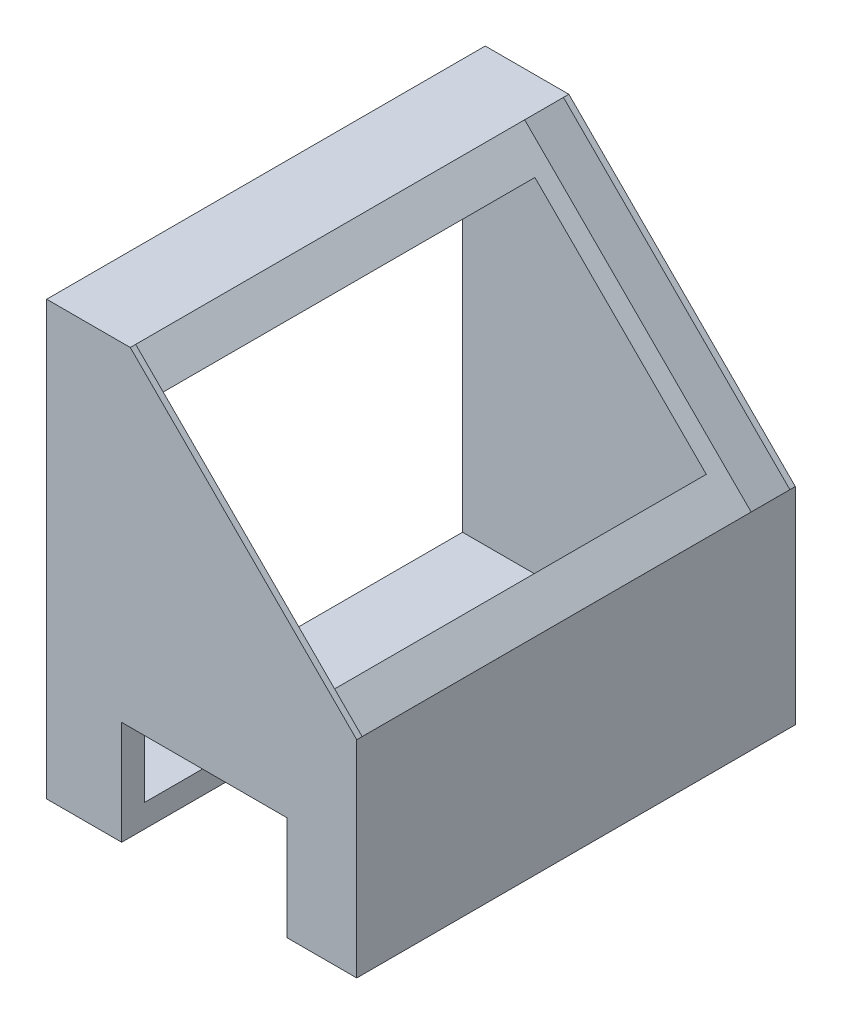
ISO-10303-21;
HEADER;
FILE_DESCRIPTION(('STEP AP214'),'2;1');
FILE_NAME('part.step','',(''),(''),'','','');
FILE_SCHEMA(('AUTOMOTIVE_DESIGN { 1 0 10303 214 1 1 1 1 }'));
ENDSEC;
DATA;
#1=APPLICATION_CONTEXT('core data for automotive mechanical design processes');
#2=APPLICATION_PROTOCOL_DEFINITION('international standard','automotive_design',2000,#1);
#3=PRODUCT_CONTEXT('',#1,'mechanical');
#4=PRODUCT('Part','Part','',(#3));
#5=PRODUCT_RELATED_PRODUCT_CATEGORY('part','',(#4));
#6=PRODUCT_DEFINITION_FORMATION('','',#4);
#7=PRODUCT_DEFINITION_CONTEXT('part definition',#1,'design');
#8=PRODUCT_DEFINITION('design','',#6,#7);
#9=PRODUCT_DEFINITION_SHAPE('','',#8);
#10=(LENGTH_UNIT() NAMED_UNIT(*) SI_UNIT(.MILLI.,.METRE.));
#11=(NAMED_UNIT(*) PLANE_ANGLE_UNIT() SI_UNIT($,.RADIAN.));
#12=(NAMED_UNIT(*) SI_UNIT($,.STERADIAN.) SOLID_ANGLE_UNIT());
#13=UNCERTAINTY_MEASURE_WITH_UNIT(LENGTH_MEASURE(1.E-05),#10,'distance_accuracy_value','');
#14=(GEOMETRIC_REPRESENTATION_CONTEXT(3) GLOBAL_UNCERTAINTY_ASSIGNED_CONTEXT((#13)) GLOBAL_UNIT_ASSIGNED_CONTEXT((#10,
#11,#12)) REPRESENTATION_CONTEXT('',''));
#15=CARTESIAN_POINT('',(0.,0.,0.));
#16=DIRECTION('',(0.,0.,1.));
#17=DIRECTION('',(1.,0.,0.));
#18=AXIS2_PLACEMENT_3D('',#15,#16,#17);
#19=CARTESIAN_POINT('',(126.536726339902,37.5530647127887,144.02813397562));
#20=DIRECTION('',(0.,0.,1.));
#21=DIRECTION('',(1.,0.,0.));
#22=AXIS2_PLACEMENT_3D('',#19,#20,#21);
#23=PLANE('',#22);
#24=DIRECTION('',(0.707106781186546,-0.707106781186549,0.));
#25=VECTOR('',#24,1.);
#26=CARTESIAN_POINT('',(40.0448955263453,40.0448955263451,144.02813397562));
#27=LINE('',#26,#25);
#28=CARTESIAN_POINT('',(42.5367263399016,37.5530647127887,144.02813397562));
#29=VERTEX_POINT('',#28);
#30=CARTESIAN_POINT('',(68.5367263399016,11.5530647127886,144.02813397562));
#31=VERTEX_POINT('',#30);
#32=EDGE_CURVE('E341',#29,#31,#27,.T.);
#33=ORIENTED_EDGE('',*,*,#32,.T.);
#34=DIRECTION('',(0.,-1.,0.));
#35=VECTOR('',#34,1.);
#36=CARTESIAN_POINT('',(68.5367263399016,37.5530647127887,144.02813397562));
#37=LINE('',#36,#35);
#38=CARTESIAN_POINT('',(68.5367263399016,8.,144.02813397562));
#39=VERTEX_POINT('',#38);
#40=EDGE_CURVE('E269',#31,#39,#37,.T.);
#41=ORIENTED_EDGE('',*,*,#40,.T.);
#42=DIRECTION('',(-1.,0.,0.));
#43=VECTOR('',#42,1.);
#44=CARTESIAN_POINT('',(126.536726339902,8.,144.02813397562));
#45=LINE('',#44,#43);
#46=CARTESIAN_POINT('',(42.5367263399016,8.,144.02813397562));
#47=VERTEX_POINT('',#46);
#48=EDGE_CURVE('E334',#39,#47,#45,.T.);
#49=ORIENTED_EDGE('',*,*,#48,.T.);
#50=DIRECTION('',(0.,1.,0.));
#51=VECTOR('',#50,1.);
#52=CARTESIAN_POINT('',(42.5367263399016,37.5530647127887,144.02813397562));
#53=LINE('',#52,#51);
#54=EDGE_CURVE('E312',#47,#29,#53,.T.);
#55=ORIENTED_EDGE('',*,*,#54,.T.);
#56=EDGE_LOOP('',(#33,#41,#49,#55));
#57=FACE_BOUND('',#56,.T.);
#58=ADVANCED_FACE('F40',(#57),#23,.F.);
#59=CARTESIAN_POINT('',(69.7420026748366,10.3477883778537,144.125));
#60=DIRECTION('',(0.707106781186546,-0.707106781186549,0.));
#61=DIRECTION('',(0.707106781186549,0.707106781186546,0.));
#62=AXIS2_PLACEMENT_3D('',#59,#60,#61);
#63=PLANE('',#62);
#64=DIRECTION('',(-0.707106781186549,-0.707106781186546,0.));
#65=VECTOR('',#64,1.);
#66=CARTESIAN_POINT('',(69.7420026748366,10.3477883778537,144.02813397562));
#67=LINE('',#66,#65);
#68=CARTESIAN_POINT('',(96.9472790097717,37.5530647127887,144.02813397562));
#69=VERTEX_POINT('',#68);
#70=CARTESIAN_POINT('',(95.394214296983,36.,144.02813397562));
#71=VERTEX_POINT('',#70);
#72=EDGE_CURVE('E329',#69,#71,#67,.T.);
#73=ORIENTED_EDGE('',*,*,#72,.T.);
#74=DIRECTION('',(0.,0.,1.));
#75=VECTOR('',#74,1.);
#76=CARTESIAN_POINT('',(95.394214296983,36.,144.125));
#77=LINE('',#76,#75);
#78=CARTESIAN_POINT('',(95.394214296983,36.,144.125));
#79=VERTEX_POINT('',#78);
#80=EDGE_CURVE('E280',#71,#79,#77,.T.);
#81=ORIENTED_EDGE('',*,*,#80,.T.);
#82=DIRECTION('',(0.707106781186549,0.707106781186546,0.));
#83=VECTOR('',#82,1.);
#84=CARTESIAN_POINT('',(69.7420026748366,10.3477883778537,144.125));
#85=LINE('',#84,#83);
#86=CARTESIAN_POINT('',(96.9472790097717,37.5530647127887,144.125));
#87=VERTEX_POINT('',#86);
#88=EDGE_CURVE('E400',#79,#87,#85,.T.);
#89=ORIENTED_EDGE('',*,*,#88,.T.);
#90=DIRECTION('',(0.,0.,1.));
#91=VECTOR('',#90,1.);
#92=CARTESIAN_POINT('',(96.9472790097717,37.5530647127887,144.125));
#93=LINE('',#92,#91);
#94=EDGE_CURVE('E298',#69,#87,#93,.T.);
#95=ORIENTED_EDGE('',*,*,#94,.F.);
#96=EDGE_LOOP('',(#73,#81,#89,#95));
#97=FACE_BOUND('',#96,.T.);
#98=ADVANCED_FACE('F576',(#97),#63,.F.);
#99=CARTESIAN_POINT('',(0.,0.,152.));
#100=DIRECTION('',(0.,1.,0.));
#101=DIRECTION('',(0.,0.,1.));
#102=AXIS2_PLACEMENT_3D('',#99,#100,#101);
#103=PLANE('',#102);
#104=DIRECTION('',(1.,0.,0.));
#105=VECTOR('',#104,1.);
#106=CARTESIAN_POINT('',(68.5367263399016,0.,77.4));
#107=LINE('',#106,#105);
#108=CARTESIAN_POINT('',(68.5367263399016,0.,77.4));
#109=VERTEX_POINT('',#108);
#110=CARTESIAN_POINT('',(125.836726339902,0.,77.4));
#111=VERTEX_POINT('',#110);
#112=EDGE_CURVE('E224',#109,#111,#107,.T.);
#113=ORIENTED_EDGE('',*,*,#112,.F.);
#114=DIRECTION('',(0.,0.,1.));
#115=VECTOR('',#114,1.);
#116=CARTESIAN_POINT('',(68.5367263399016,0.,77.4));
#117=LINE('',#116,#115);
#118=CARTESIAN_POINT('',(68.5367263399016,0.,152.));
#119=VERTEX_POINT('',#118);
#120=EDGE_CURVE('E233',#109,#119,#117,.T.);
#121=ORIENTED_EDGE('',*,*,#120,.T.);
#122=DIRECTION('',(1.,0.,0.));
#123=VECTOR('',#122,1.);
#124=CARTESIAN_POINT('',(0.,0.,152.));
#125=LINE('',#124,#123);
#126=CARTESIAN_POINT('',(42.5367263399016,0.,152.));
#127=VERTEX_POINT('',#126);
#128=EDGE_CURVE('E455',#127,#119,#125,.T.);
#129=ORIENTED_EDGE('',*,*,#128,.F.);
#130=DIRECTION('',(0.,0.,-1.));
#131=VECTOR('',#130,1.);
#132=CARTESIAN_POINT('',(42.5367263399016,0.,172.));
#133=LINE('',#132,#131);
#134=CARTESIAN_POINT('',(42.5367263399016,0.,0.));
#135=VERTEX_POINT('',#134);
#136=EDGE_CURVE('E348',#127,#135,#133,.T.);
#137=ORIENTED_EDGE('',*,*,#136,.T.);
#138=DIRECTION('',(1.,0.,0.));
#139=VECTOR('',#138,1.);
#140=CARTESIAN_POINT('',(0.,0.,0.));
#141=LINE('',#140,#139);
#142=CARTESIAN_POINT('',(150.,0.,0.));
#143=VERTEX_POINT('',#142);
#144=EDGE_CURVE('E450',#135,#143,#141,.T.);
#145=ORIENTED_EDGE('',*,*,#144,.T.);
#146=DIRECTION('',(0.,0.,-1.));
#147=VECTOR('',#146,1.);
#148=CARTESIAN_POINT('',(150.,0.,152.));
#149=LINE('',#148,#147);
#150=CARTESIAN_POINT('',(150.,0.,152.));
#151=VERTEX_POINT('',#150);
#152=EDGE_CURVE('E458',#151,#143,#149,.T.);
#153=ORIENTED_EDGE('',*,*,#152,.F.);
#154=CARTESIAN_POINT('',(125.836726339902,0.,152.));
#155=VERTEX_POINT('',#154);
#156=EDGE_CURVE('E454',#155,#151,#125,.T.);
#157=ORIENTED_EDGE('',*,*,#156,.F.);
#158=DIRECTION('',(0.,0.,1.));
#159=VECTOR('',#158,1.);
#160=CARTESIAN_POINT('',(125.836726339902,0.,77.4));
#161=LINE('',#160,#159);
#162=EDGE_CURVE('E57',#111,#155,#161,.T.);
#163=ORIENTED_EDGE('',*,*,#162,.F.);
#164=EDGE_LOOP('',(#113,#121,#129,#137,#145,#153,#157,#163));
#165=FACE_BOUND('',#164,.T.);
#166=ADVANCED_FACE('F242',(#165),#103,.F.);
#167=CARTESIAN_POINT('',(0.,150.,152.));
#168=DIRECTION('',(0.,1.,0.));
#169=DIRECTION('',(0.,0.,1.));
#170=AXIS2_PLACEMENT_3D('',#167,#168,#169);
#171=PLANE('',#170);
#172=DIRECTION('',(1.,0.,0.));
#173=VECTOR('',#172,1.);
#174=CARTESIAN_POINT('',(0.,150.,0.));
#175=LINE('',#174,#173);
#176=CARTESIAN_POINT('',(42.5367263399016,150.,0.));
#177=VERTEX_POINT('',#176);
#178=CARTESIAN_POINT('',(71.51114729,150.,0.));
#179=VERTEX_POINT('',#178);
#180=EDGE_CURVE('E445',#177,#179,#175,.T.);
#181=ORIENTED_EDGE('',*,*,#180,.F.);
#182=DIRECTION('',(0.,0.,-1.));
#183=VECTOR('',#182,1.);
#184=CARTESIAN_POINT('',(42.5367263399016,150.,172.));
#185=LINE('',#184,#183);
#186=CARTESIAN_POINT('',(42.5367263399016,150.,152.));
#187=VERTEX_POINT('',#186);
#188=EDGE_CURVE('E345',#187,#177,#185,.T.);
#189=ORIENTED_EDGE('',*,*,#188,.F.);
#190=DIRECTION('',(1.,0.,0.));
#191=VECTOR('',#190,1.);
#192=CARTESIAN_POINT('',(0.,150.,152.));
#193=LINE('',#192,#191);
#194=CARTESIAN_POINT('',(71.51114729,150.,152.));
#195=VERTEX_POINT('',#194);
#196=EDGE_CURVE('E446',#187,#195,#193,.T.);
#197=ORIENTED_EDGE('',*,*,#196,.T.);
#198=DIRECTION('',(0.,0.,-1.));
#199=VECTOR('',#198,1.);
#200=CARTESIAN_POINT('',(71.51114729,150.,0.));
#201=LINE('',#200,#199);
#202=CARTESIAN_POINT('',(71.51114729,150.,150.125));
#203=VERTEX_POINT('',#202);
#204=EDGE_CURVE('E471',#195,#203,#201,.T.);
#205=ORIENTED_EDGE('',*,*,#204,.T.);
#206=DIRECTION('',(1.,0.,0.));
#207=VECTOR('',#206,1.);
#208=CARTESIAN_POINT('',(0.,150.,150.125));
#209=LINE('',#208,#207);
#210=CARTESIAN_POINT('',(71.5083919656064,150.,150.125));
#211=VERTEX_POINT('',#210);
#212=EDGE_CURVE('E442',#211,#203,#209,.T.);
#213=ORIENTED_EDGE('',*,*,#212,.F.);
#214=DIRECTION('',(0.,0.,1.));
#215=VECTOR('',#214,1.);
#216=CARTESIAN_POINT('',(71.5083919656064,150.,152.));
#217=LINE('',#216,#215);
#218=CARTESIAN_POINT('',(71.5083919656064,150.,1.87500000000002));
#219=VERTEX_POINT('',#218);
#220=EDGE_CURVE('E489',#219,#211,#217,.T.);
#221=ORIENTED_EDGE('',*,*,#220,.F.);
#222=DIRECTION('',(-1.,0.,0.));
#223=VECTOR('',#222,1.);
#224=CARTESIAN_POINT('',(0.,150.,1.87500000000002));
#225=LINE('',#224,#223);
#226=CARTESIAN_POINT('',(71.51114729,150.,1.87500000000002));
#227=VERTEX_POINT('',#226);
#228=EDGE_CURVE('E430',#227,#219,#225,.T.);
#229=ORIENTED_EDGE('',*,*,#228,.F.);
#230=EDGE_CURVE('E470',#227,#179,#201,.T.);
#231=ORIENTED_EDGE('',*,*,#230,.T.);
#232=EDGE_LOOP('',(#181,#189,#197,#205,#213,#221,#229,#231));
#233=FACE_BOUND('',#232,.T.);
#234=ADVANCED_FACE('F622',(#233),#171,.T.);
#235=CARTESIAN_POINT('',(0.,0.,152.));
#236=DIRECTION('',(0.,0.,-1.));
#237=DIRECTION('',(-1.,0.,0.));
#238=AXIS2_PLACEMENT_3D('',#235,#236,#237);
#239=PLANE('',#238);
#240=ORIENTED_EDGE('',*,*,#128,.T.);
#241=DIRECTION('',(0.,-1.,0.));
#242=VECTOR('',#241,1.);
#243=CARTESIAN_POINT('',(68.5367263399016,0.,152.));
#244=LINE('',#243,#242);
#245=CARTESIAN_POINT('',(68.5367263399016,36.,152.));
#246=VERTEX_POINT('',#245);
#247=EDGE_CURVE('E236',#246,#119,#244,.T.);
#248=ORIENTED_EDGE('',*,*,#247,.F.);
#249=DIRECTION('',(-1.,0.,0.));
#250=VECTOR('',#249,1.);
#251=CARTESIAN_POINT('',(68.5367263399016,36.,152.));
#252=LINE('',#251,#250);
#253=CARTESIAN_POINT('',(125.836726339902,36.,152.));
#254=VERTEX_POINT('',#253);
#255=EDGE_CURVE('E230',#254,#246,#252,.T.);
#256=ORIENTED_EDGE('',*,*,#255,.F.);
#257=DIRECTION('',(0.,1.,0.));
#258=VECTOR('',#257,1.);
#259=CARTESIAN_POINT('',(125.836726339902,0.,152.));
#260=LINE('',#259,#258);
#261=EDGE_CURVE('E251',#155,#254,#260,.T.);
#262=ORIENTED_EDGE('',*,*,#261,.F.);
#263=ORIENTED_EDGE('',*,*,#156,.T.);
#264=DIRECTION('',(0.,1.,0.));
#265=VECTOR('',#264,1.);
#266=CARTESIAN_POINT('',(150.,0.,152.));
#267=LINE('',#266,#265);
#268=CARTESIAN_POINT('',(150.,71.5111472899997,152.));
#269=VERTEX_POINT('',#268);
#270=EDGE_CURVE('E449',#151,#269,#267,.T.);
#271=ORIENTED_EDGE('',*,*,#270,.T.);
#272=DIRECTION('',(-0.707106781186546,0.707106781186549,0.));
#273=VECTOR('',#272,1.);
#274=CARTESIAN_POINT('',(71.51114729,150.,152.));
#275=LINE('',#274,#273);
#276=EDGE_CURVE('E481',#269,#195,#275,.T.);
#277=ORIENTED_EDGE('',*,*,#276,.T.);
#278=ORIENTED_EDGE('',*,*,#196,.F.);
#279=DIRECTION('',(0.,1.,0.));
#280=VECTOR('',#279,1.);
#281=CARTESIAN_POINT('',(42.5367263399016,0.,152.));
#282=LINE('',#281,#280);
#283=EDGE_CURVE('E366',#127,#187,#282,.T.);
#284=ORIENTED_EDGE('',*,*,#283,.F.);
#285=EDGE_LOOP('',(#240,#248,#256,#262,#263,#271,#277,#278,#284));
#286=FACE_BOUND('',#285,.T.);
#287=ADVANCED_FACE('F528',(#286),#239,.F.);
#288=CARTESIAN_POINT('',(0.,0.,0.));
#289=DIRECTION('',(0.,0.,-1.));
#290=DIRECTION('',(-1.,0.,0.));
#291=AXIS2_PLACEMENT_3D('',#288,#289,#290);
#292=PLANE('',#291);
#293=ORIENTED_EDGE('',*,*,#144,.F.);
#294=DIRECTION('',(0.,1.,0.));
#295=VECTOR('',#294,1.);
#296=CARTESIAN_POINT('',(42.5367263399016,0.,0.));
#297=LINE('',#296,#295);
#298=EDGE_CURVE('E362',#135,#177,#297,.T.);
#299=ORIENTED_EDGE('',*,*,#298,.T.);
#300=ORIENTED_EDGE('',*,*,#180,.T.);
#301=DIRECTION('',(0.707106781186546,-0.707106781186549,0.));
#302=VECTOR('',#301,1.);
#303=CARTESIAN_POINT('',(110.755573645,110.755573645,0.));
#304=LINE('',#303,#302);
#305=CARTESIAN_POINT('',(150.,71.5111472899997,0.));
#306=VERTEX_POINT('',#305);
#307=EDGE_CURVE('E475',#179,#306,#304,.T.);
#308=ORIENTED_EDGE('',*,*,#307,.T.);
#309=DIRECTION('',(0.,1.,0.));
#310=VECTOR('',#309,1.);
#311=CARTESIAN_POINT('',(150.,0.,0.));
#312=LINE('',#311,#310);
#313=EDGE_CURVE('E461',#143,#306,#312,.T.);
#314=ORIENTED_EDGE('',*,*,#313,.F.);
#315=EDGE_LOOP('',(#293,#299,#300,#308,#314));
#316=FACE_BOUND('',#315,.T.);
#317=ADVANCED_FACE('F535',(#316),#292,.T.);
#318=CARTESIAN_POINT('',(10.3450330551667,69.7447579975238,144.125));
#319=DIRECTION('',(0.,0.,1.));
#320=DIRECTION('',(1.,0.,0.));
#321=AXIS2_PLACEMENT_3D('',#318,#319,#320);
#322=PLANE('',#321);
#323=DIRECTION('',(-1.,0.,0.));
#324=VECTOR('',#323,1.);
#325=CARTESIAN_POINT('',(10.3450330551667,36.,144.125));
#326=LINE('',#325,#324);
#327=CARTESIAN_POINT('',(68.5367263399016,36.,144.125));
#328=VERTEX_POINT('',#327);
#329=EDGE_CURVE('E284',#79,#328,#326,.T.);
#330=ORIENTED_EDGE('',*,*,#329,.T.);
#331=DIRECTION('',(0.,-1.,0.));
#332=VECTOR('',#331,1.);
#333=CARTESIAN_POINT('',(68.5367263399016,69.7447579975238,144.125));
#334=LINE('',#333,#332);
#335=CARTESIAN_POINT('',(68.5367263399016,11.5530647127886,144.125));
#336=VERTEX_POINT('',#335);
#337=EDGE_CURVE('E276',#328,#336,#334,.T.);
#338=ORIENTED_EDGE('',*,*,#337,.T.);
#339=DIRECTION('',(0.707106781186546,-0.707106781186549,0.));
#340=VECTOR('',#339,1.);
#341=CARTESIAN_POINT('',(10.3450330551667,69.7447579975238,144.125));
#342=LINE('',#341,#340);
#343=CARTESIAN_POINT('',(42.5367263399016,37.5530647127887,144.125));
#344=VERTEX_POINT('',#343);
#345=EDGE_CURVE('E370',#344,#336,#342,.T.);
#346=ORIENTED_EDGE('',*,*,#345,.F.);
#347=DIRECTION('',(0.,-1.,0.));
#348=VECTOR('',#347,1.);
#349=CARTESIAN_POINT('',(42.5367263399016,69.7447579975238,144.125));
#350=LINE('',#349,#348);
#351=CARTESIAN_POINT('',(42.5367263399016,101.936451282259,144.125));
#352=VERTEX_POINT('',#351);
#353=EDGE_CURVE('E358',#352,#344,#350,.T.);
#354=ORIENTED_EDGE('',*,*,#353,.F.);
#355=DIRECTION('',(0.707106781186549,0.707106781186546,0.));
#356=VECTOR('',#355,1.);
#357=CARTESIAN_POINT('',(10.3450330551667,69.7447579975238,144.125));
#358=LINE('',#357,#356);
#359=CARTESIAN_POINT('',(67.6206823312772,127.020407273634,144.125));
#360=VERTEX_POINT('',#359);
#361=EDGE_CURVE('E390',#352,#360,#358,.T.);
#362=ORIENTED_EDGE('',*,*,#361,.T.);
#363=DIRECTION('',(0.707106781186546,-0.707106781186549,0.));
#364=VECTOR('',#363,1.);
#365=CARTESIAN_POINT('',(67.6206823312772,127.020407273634,144.125));
#366=LINE('',#365,#364);
#367=CARTESIAN_POINT('',(127.017651950947,67.6234376539639,144.125));
#368=VERTEX_POINT('',#367);
#369=EDGE_CURVE('E369',#360,#368,#366,.T.);
#370=ORIENTED_EDGE('',*,*,#369,.T.);
#371=CARTESIAN_POINT('',(126.536726339902,67.1425120429184,144.125));
#372=VERTEX_POINT('',#371);
#373=EDGE_CURVE('E374',#372,#368,#85,.T.);
#374=ORIENTED_EDGE('',*,*,#373,.F.);
#375=DIRECTION('',(0.,1.,0.));
#376=VECTOR('',#375,1.);
#377=CARTESIAN_POINT('',(126.536726339902,37.5530647127887,144.125));
#378=LINE('',#377,#376);
#379=CARTESIAN_POINT('',(126.536726339902,37.5530647127887,144.125));
#380=VERTEX_POINT('',#379);
#381=EDGE_CURVE('E292',#380,#372,#378,.T.);
#382=ORIENTED_EDGE('',*,*,#381,.F.);
#383=DIRECTION('',(1.,0.,0.));
#384=VECTOR('',#383,1.);
#385=CARTESIAN_POINT('',(96.5367263399015,37.5530647127887,144.125));
#386=LINE('',#385,#384);
#387=EDGE_CURVE('E295',#87,#380,#386,.T.);
#388=ORIENTED_EDGE('',*,*,#387,.F.);
#389=ORIENTED_EDGE('',*,*,#88,.F.);
#390=EDGE_LOOP('',(#330,#338,#346,#354,#362,#370,#374,#382,#388,#389));
#391=FACE_BOUND('',#390,.T.);
#392=ADVANCED_FACE('F520',(#391),#322,.F.);
#393=CARTESIAN_POINT('',(10.3450330551667,69.7447579975238,144.125));
#394=DIRECTION('',(-0.707106781186546,0.707106781186549,0.));
#395=DIRECTION('',(-0.707106781186549,-0.707106781186546,0.));
#396=AXIS2_PLACEMENT_3D('',#393,#394,#395);
#397=PLANE('',#396);
#398=DIRECTION('',(0.,0.,1.));
#399=VECTOR('',#398,1.);
#400=CARTESIAN_POINT('',(42.5367263399016,101.936451282259,144.125));
#401=LINE('',#400,#399);
#402=CARTESIAN_POINT('',(42.5367263399016,101.936451282259,7.87500000000002));
#403=VERTEX_POINT('',#402);
#404=EDGE_CURVE('E355',#403,#352,#401,.T.);
#405=ORIENTED_EDGE('',*,*,#404,.F.);
#406=DIRECTION('',(0.707106781186549,0.707106781186546,0.));
#407=VECTOR('',#406,1.);
#408=CARTESIAN_POINT('',(10.3450330551667,69.7447579975238,7.87500000000002));
#409=LINE('',#408,#407);
#410=CARTESIAN_POINT('',(67.6206823312772,127.020407273634,7.87500000000002));
#411=VERTEX_POINT('',#410);
#412=EDGE_CURVE('E394',#403,#411,#409,.T.);
#413=ORIENTED_EDGE('',*,*,#412,.T.);
#414=DIRECTION('',(0.,0.,1.));
#415=VECTOR('',#414,1.);
#416=CARTESIAN_POINT('',(67.6206823312772,127.020407273634,144.125));
#417=LINE('',#416,#415);
#418=EDGE_CURVE('E375',#411,#360,#417,.T.);
#419=ORIENTED_EDGE('',*,*,#418,.T.);
#420=ORIENTED_EDGE('',*,*,#361,.F.);
#421=EDGE_LOOP('',(#405,#413,#419,#420));
#422=FACE_BOUND('',#421,.T.);
#423=ADVANCED_FACE('F582',(#422),#397,.F.);
#424=CARTESIAN_POINT('',(10.3450330551667,69.7447579975238,7.87500000000002));
#425=DIRECTION('',(0.,0.,-1.));
#426=DIRECTION('',(-1.,0.,0.));
#427=AXIS2_PLACEMENT_3D('',#424,#425,#426);
#428=PLANE('',#427);
#429=DIRECTION('',(0.,-1.,0.));
#430=VECTOR('',#429,1.);
#431=CARTESIAN_POINT('',(126.536726339902,37.5530647127887,7.87500000000002));
#432=LINE('',#431,#430);
#433=CARTESIAN_POINT('',(126.536726339902,67.1425120429184,7.87500000000002));
#434=VERTEX_POINT('',#433);
#435=CARTESIAN_POINT('',(126.536726339902,8.,7.87500000000002));
#436=VERTEX_POINT('',#435);
#437=EDGE_CURVE('E307',#434,#436,#432,.T.);
#438=ORIENTED_EDGE('',*,*,#437,.F.);
#439=DIRECTION('',(0.707106781186549,0.707106781186546,0.));
#440=VECTOR('',#439,1.);
#441=CARTESIAN_POINT('',(69.7420026748366,10.3477883778537,7.87500000000002));
#442=LINE('',#441,#440);
#443=CARTESIAN_POINT('',(127.017651950947,67.6234376539639,7.87500000000002));
#444=VERTEX_POINT('',#443);
#445=EDGE_CURVE('E397',#434,#444,#442,.T.);
#446=ORIENTED_EDGE('',*,*,#445,.T.);
#447=DIRECTION('',(-0.707106781186546,0.707106781186549,0.));
#448=VECTOR('',#447,1.);
#449=CARTESIAN_POINT('',(67.6206823312772,127.020407273634,7.87500000000002));
#450=LINE('',#449,#448);
#451=EDGE_CURVE('E383',#444,#411,#450,.T.);
#452=ORIENTED_EDGE('',*,*,#451,.T.);
#453=ORIENTED_EDGE('',*,*,#412,.F.);
#454=DIRECTION('',(0.,1.,0.));
#455=VECTOR('',#454,1.);
#456=CARTESIAN_POINT('',(42.5367263399016,69.7447579975238,7.87500000000002));
#457=LINE('',#456,#455);
#458=CARTESIAN_POINT('',(42.5367263399016,8.,7.87500000000002));
#459=VERTEX_POINT('',#458);
#460=EDGE_CURVE('E352',#459,#403,#457,.T.);
#461=ORIENTED_EDGE('',*,*,#460,.F.);
#462=DIRECTION('',(-1.,0.,0.));
#463=VECTOR('',#462,1.);
#464=CARTESIAN_POINT('',(126.536726339902,8.,7.87500000000002));
#465=LINE('',#464,#463);
#466=EDGE_CURVE('E320',#436,#459,#465,.T.);
#467=ORIENTED_EDGE('',*,*,#466,.F.);
#468=EDGE_LOOP('',(#438,#446,#452,#453,#461,#467));
#469=FACE_BOUND('',#468,.T.);
#470=ADVANCED_FACE('F565',(#469),#428,.F.);
#471=CARTESIAN_POINT('',(40.0448955263453,40.0448955263451,0.));
#472=DIRECTION('',(0.707106781186549,0.707106781186546,0.));
#473=DIRECTION('',(-0.707106781186546,0.707106781186549,0.));
#474=AXIS2_PLACEMENT_3D('',#471,#472,#473);
#475=PLANE('',#474);
#476=DIRECTION('',(0.,0.,1.));
#477=VECTOR('',#476,1.);
#478=CARTESIAN_POINT('',(68.5367263399016,11.5530647127886,0.));
#479=LINE('',#478,#477);
#480=EDGE_CURVE('E273',#31,#336,#479,.T.);
#481=ORIENTED_EDGE('',*,*,#480,.F.);
#482=ORIENTED_EDGE('',*,*,#32,.F.);
#483=DIRECTION('',(0.,0.,1.));
#484=VECTOR('',#483,1.);
#485=CARTESIAN_POINT('',(42.5367263399016,37.5530647127887,0.));
#486=LINE('',#485,#484);
#487=EDGE_CURVE('E492',#29,#344,#486,.T.);
#488=ORIENTED_EDGE('',*,*,#487,.T.);
#489=ORIENTED_EDGE('',*,*,#345,.T.);
#490=EDGE_LOOP('',(#481,#482,#488,#489));
#491=FACE_BOUND('',#490,.T.);
#492=ADVANCED_FACE('F510',(#491),#475,.T.);
#493=CARTESIAN_POINT('',(150.,0.,152.));
#494=DIRECTION('',(-1.,0.,0.));
#495=DIRECTION('',(0.,0.,1.));
#496=AXIS2_PLACEMENT_3D('',#493,#494,#495);
#497=PLANE('',#496);
#498=ORIENTED_EDGE('',*,*,#313,.T.);
#499=DIRECTION('',(0.,0.,1.));
#500=VECTOR('',#499,1.);
#501=CARTESIAN_POINT('',(150.,71.5111472899997,152.));
#502=LINE('',#501,#500);
#503=EDGE_CURVE('E478',#306,#269,#502,.T.);
#504=ORIENTED_EDGE('',*,*,#503,.T.);
#505=ORIENTED_EDGE('',*,*,#270,.F.);
#506=ORIENTED_EDGE('',*,*,#152,.T.);
#507=EDGE_LOOP('',(#498,#504,#505,#506));
#508=FACE_BOUND('',#507,.T.);
#509=ADVANCED_FACE('F540',(#508),#497,.F.);
#510=CARTESIAN_POINT('',(71.51114729,150.,152.));
#511=DIRECTION('',(0.707106781186549,0.707106781186546,0.));
#512=DIRECTION('',(0.,0.,1.));
#513=AXIS2_PLACEMENT_3D('',#510,#511,#512);
#514=PLANE('',#513);
#515=DIRECTION('',(0.707106781186546,-0.707106781186549,0.));
#516=VECTOR('',#515,1.);
#517=CARTESIAN_POINT('',(71.51114729,150.,150.125));
#518=LINE('',#517,#516);
#519=CARTESIAN_POINT('',(149.99862233951,71.5125249504899,150.125));
#520=VERTEX_POINT('',#519);
#521=EDGE_CURVE('E485',#203,#520,#518,.T.);
#522=ORIENTED_EDGE('',*,*,#521,.F.);
#523=ORIENTED_EDGE('',*,*,#204,.F.);
#524=ORIENTED_EDGE('',*,*,#276,.F.);
#525=ORIENTED_EDGE('',*,*,#503,.F.);
#526=ORIENTED_EDGE('',*,*,#307,.F.);
#527=ORIENTED_EDGE('',*,*,#230,.F.);
#528=DIRECTION('',(-0.707106781186546,0.707106781186549,0.));
#529=VECTOR('',#528,1.);
#530=CARTESIAN_POINT('',(71.5097696278032,150.001377662197,1.87500000000002));
#531=LINE('',#530,#529);
#532=CARTESIAN_POINT('',(149.99862233951,71.5125249504899,1.87500000000002));
#533=VERTEX_POINT('',#532);
#534=EDGE_CURVE('E408',#533,#227,#531,.T.);
#535=ORIENTED_EDGE('',*,*,#534,.F.);
#536=DIRECTION('',(0.,0.,-1.));
#537=VECTOR('',#536,1.);
#538=CARTESIAN_POINT('',(149.99862233951,71.5125249504899,150.125));
#539=LINE('',#538,#537);
#540=EDGE_CURVE('E393',#520,#533,#539,.T.);
#541=ORIENTED_EDGE('',*,*,#540,.F.);
#542=EDGE_LOOP('',(#522,#523,#524,#525,#526,#527,#535,#541));
#543=FACE_BOUND('',#542,.T.);
#544=ADVANCED_FACE('F43',(#543),#514,.T.);
#545=CARTESIAN_POINT('',(58.0747407852588,136.566348819652,150.125));
#546=DIRECTION('',(0.,0.,1.));
#547=DIRECTION('',(1.,0.,0.));
#548=AXIS2_PLACEMENT_3D('',#545,#546,#547);
#549=PLANE('',#548);
#550=ORIENTED_EDGE('',*,*,#212,.T.);
#551=ORIENTED_EDGE('',*,*,#521,.T.);
#552=DIRECTION('',(0.707106781186549,0.707106781186546,0.));
#553=VECTOR('',#552,1.);
#554=CARTESIAN_POINT('',(136.563593496965,58.0774961079455,150.125));
#555=LINE('',#554,#553);
#556=CARTESIAN_POINT('',(136.563593496965,58.0774961079455,150.125));
#557=VERTEX_POINT('',#556);
#558=EDGE_CURVE('E420',#557,#520,#555,.T.);
#559=ORIENTED_EDGE('',*,*,#558,.F.);
#560=DIRECTION('',(0.707106781186546,-0.707106781186549,0.));
#561=VECTOR('',#560,1.);
#562=CARTESIAN_POINT('',(58.0747407852588,136.566348819652,150.125));
#563=LINE('',#562,#561);
#564=CARTESIAN_POINT('',(58.0747407852588,136.566348819652,150.125));
#565=VERTEX_POINT('',#564);
#566=EDGE_CURVE('E403',#565,#557,#563,.T.);
#567=ORIENTED_EDGE('',*,*,#566,.F.);
#568=DIRECTION('',(0.707106781186549,0.707106781186546,0.));
#569=VECTOR('',#568,1.);
#570=CARTESIAN_POINT('',(58.0747407852588,136.566348819652,150.125));
#571=LINE('',#570,#569);
#572=EDGE_CURVE('E426',#565,#211,#571,.T.);
#573=ORIENTED_EDGE('',*,*,#572,.T.);
#574=EDGE_LOOP('',(#550,#551,#559,#567,#573));
#575=FACE_BOUND('',#574,.T.);
#576=ADVANCED_FACE('F619',(#575),#549,.F.);
#577=CARTESIAN_POINT('',(58.0747407852588,136.566348819652,150.125));
#578=DIRECTION('',(-0.707106781186546,0.707106781186549,0.));
#579=DIRECTION('',(-0.707106781186549,-0.707106781186546,0.));
#580=AXIS2_PLACEMENT_3D('',#577,#578,#579);
#581=PLANE('',#580);
#582=ORIENTED_EDGE('',*,*,#220,.T.);
#583=ORIENTED_EDGE('',*,*,#572,.F.);
#584=DIRECTION('',(0.,0.,1.));
#585=VECTOR('',#584,1.);
#586=CARTESIAN_POINT('',(58.0747407852588,136.566348819652,150.125));
#587=LINE('',#586,#585);
#588=CARTESIAN_POINT('',(58.0747407852588,136.566348819652,1.87500000000002));
#589=VERTEX_POINT('',#588);
#590=EDGE_CURVE('E416',#589,#565,#587,.T.);
#591=ORIENTED_EDGE('',*,*,#590,.F.);
#592=DIRECTION('',(0.707106781186549,0.707106781186546,0.));
#593=VECTOR('',#592,1.);
#594=CARTESIAN_POINT('',(58.0747407852588,136.566348819652,1.87500000000002));
#595=LINE('',#594,#593);
#596=EDGE_CURVE('E431',#589,#219,#595,.T.);
#597=ORIENTED_EDGE('',*,*,#596,.T.);
#598=EDGE_LOOP('',(#582,#583,#591,#597));
#599=FACE_BOUND('',#598,.T.);
#600=ADVANCED_FACE('F649',(#599),#581,.F.);
#601=CARTESIAN_POINT('',(58.0747407852588,136.566348819652,1.87500000000002));
#602=DIRECTION('',(0.,0.,-1.));
#603=DIRECTION('',(-1.,0.,0.));
#604=AXIS2_PLACEMENT_3D('',#601,#602,#603);
#605=PLANE('',#604);
#606=ORIENTED_EDGE('',*,*,#228,.T.);
#607=ORIENTED_EDGE('',*,*,#596,.F.);
#608=DIRECTION('',(-0.707106781186546,0.707106781186549,0.));
#609=VECTOR('',#608,1.);
#610=CARTESIAN_POINT('',(58.0747407852588,136.566348819652,1.87500000000002));
#611=LINE('',#610,#609);
#612=CARTESIAN_POINT('',(136.563593496965,58.0774961079455,1.87500000000002));
#613=VERTEX_POINT('',#612);
#614=EDGE_CURVE('E412',#613,#589,#611,.T.);
#615=ORIENTED_EDGE('',*,*,#614,.F.);
#616=DIRECTION('',(0.707106781186549,0.707106781186546,0.));
#617=VECTOR('',#616,1.);
#618=CARTESIAN_POINT('',(136.563593496965,58.0774961079455,1.87500000000002));
#619=LINE('',#618,#617);
#620=EDGE_CURVE('E435',#613,#533,#619,.T.);
#621=ORIENTED_EDGE('',*,*,#620,.T.);
#622=ORIENTED_EDGE('',*,*,#534,.T.);
#623=EDGE_LOOP('',(#606,#607,#615,#621,#622));
#624=FACE_BOUND('',#623,.T.);
#625=ADVANCED_FACE('F640',(#624),#605,.F.);
#626=CARTESIAN_POINT('',(136.563593496965,58.0774961079455,150.125));
#627=DIRECTION('',(0.707106781186546,-0.707106781186549,0.));
#628=DIRECTION('',(0.707106781186549,0.707106781186546,0.));
#629=AXIS2_PLACEMENT_3D('',#626,#627,#628);
#630=PLANE('',#629);
#631=ORIENTED_EDGE('',*,*,#540,.T.);
#632=ORIENTED_EDGE('',*,*,#620,.F.);
#633=DIRECTION('',(0.,0.,-1.));
#634=VECTOR('',#633,1.);
#635=CARTESIAN_POINT('',(136.563593496965,58.0774961079455,150.125));
#636=LINE('',#635,#634);
#637=EDGE_CURVE('E407',#557,#613,#636,.T.);
#638=ORIENTED_EDGE('',*,*,#637,.F.);
#639=ORIENTED_EDGE('',*,*,#558,.T.);
#640=EDGE_LOOP('',(#631,#632,#638,#639));
#641=FACE_BOUND('',#640,.T.);
#642=ADVANCED_FACE('F644',(#641),#630,.F.);
#643=CARTESIAN_POINT('',(97.3205448024557,97.3205448024553,0.));
#644=DIRECTION('',(0.707106781186549,0.707106781186546,0.));
#645=DIRECTION('',(-0.707106781186546,0.707106781186549,0.));
#646=AXIS2_PLACEMENT_3D('',#643,#644,#645);
#647=PLANE('',#646);
#648=ORIENTED_EDGE('',*,*,#369,.F.);
#649=ORIENTED_EDGE('',*,*,#418,.F.);
#650=ORIENTED_EDGE('',*,*,#451,.F.);
#651=DIRECTION('',(0.,0.,-1.));
#652=VECTOR('',#651,1.);
#653=CARTESIAN_POINT('',(127.017651950947,67.6234376539639,144.125));
#654=LINE('',#653,#652);
#655=EDGE_CURVE('E379',#368,#444,#654,.T.);
#656=ORIENTED_EDGE('',*,*,#655,.F.);
#657=EDGE_LOOP('',(#648,#649,#650,#656));
#658=FACE_BOUND('',#657,.T.);
#659=ORIENTED_EDGE('',*,*,#566,.T.);
#660=ORIENTED_EDGE('',*,*,#637,.T.);
#661=ORIENTED_EDGE('',*,*,#614,.T.);
#662=ORIENTED_EDGE('',*,*,#590,.T.);
#663=EDGE_LOOP('',(#659,#660,#661,#662));
#664=FACE_BOUND('',#663,.T.);
#665=ADVANCED_FACE('F561',(#658,#664),#647,.T.);
#666=ORIENTED_EDGE('',*,*,#445,.F.);
#667=DIRECTION('',(0.,0.,1.));
#668=VECTOR('',#667,1.);
#669=CARTESIAN_POINT('',(126.536726339902,67.1425120429184,144.125));
#670=LINE('',#669,#668);
#671=EDGE_CURVE('E302',#434,#372,#670,.T.);
#672=ORIENTED_EDGE('',*,*,#671,.T.);
#673=ORIENTED_EDGE('',*,*,#373,.T.);
#674=ORIENTED_EDGE('',*,*,#655,.T.);
#675=EDGE_LOOP('',(#666,#672,#673,#674));
#676=FACE_BOUND('',#675,.T.);
#677=ADVANCED_FACE('F553',(#676),#63,.F.);
#678=CARTESIAN_POINT('',(42.5367263399016,0.,172.));
#679=DIRECTION('',(-1.,0.,0.));
#680=DIRECTION('',(0.,0.,1.));
#681=AXIS2_PLACEMENT_3D('',#678,#679,#680);
#682=PLANE('',#681);
#683=DIRECTION('',(0.,0.,1.));
#684=VECTOR('',#683,1.);
#685=CARTESIAN_POINT('',(42.5367263399016,8.,7.87500000000002));
#686=LINE('',#685,#684);
#687=EDGE_CURVE('E306',#459,#47,#686,.T.);
#688=ORIENTED_EDGE('',*,*,#687,.F.);
#689=ORIENTED_EDGE('',*,*,#460,.T.);
#690=ORIENTED_EDGE('',*,*,#404,.T.);
#691=ORIENTED_EDGE('',*,*,#353,.T.);
#692=ORIENTED_EDGE('',*,*,#487,.F.);
#693=ORIENTED_EDGE('',*,*,#54,.F.);
#694=EDGE_LOOP('',(#688,#689,#690,#691,#692,#693));
#695=FACE_BOUND('',#694,.T.);
#696=ORIENTED_EDGE('',*,*,#283,.T.);
#697=ORIENTED_EDGE('',*,*,#188,.T.);
#698=ORIENTED_EDGE('',*,*,#298,.F.);
#699=ORIENTED_EDGE('',*,*,#136,.F.);
#700=EDGE_LOOP('',(#696,#697,#698,#699));
#701=FACE_BOUND('',#700,.T.);
#702=ADVANCED_FACE('F513',(#695,#701),#682,.T.);
#703=DIRECTION('',(0.,1.,0.));
#704=VECTOR('',#703,1.);
#705=CARTESIAN_POINT('',(125.836726339902,37.5530647127887,144.02813397562));
#706=LINE('',#705,#704);
#707=CARTESIAN_POINT('',(125.836726339902,8.,144.02813397562));
#708=VERTEX_POINT('',#707);
#709=CARTESIAN_POINT('',(125.836726339902,36.,144.02813397562));
#710=VERTEX_POINT('',#709);
#711=EDGE_CURVE('E260',#708,#710,#706,.T.);
#712=ORIENTED_EDGE('',*,*,#711,.T.);
#713=DIRECTION('',(-1.,0.,0.));
#714=VECTOR('',#713,1.);
#715=CARTESIAN_POINT('',(126.536726339902,36.,144.02813397562));
#716=LINE('',#715,#714);
#717=EDGE_CURVE('E11',#710,#71,#716,.T.);
#718=ORIENTED_EDGE('',*,*,#717,.T.);
#719=ORIENTED_EDGE('',*,*,#72,.F.);
#720=DIRECTION('',(-1.,0.,0.));
#721=VECTOR('',#720,1.);
#722=CARTESIAN_POINT('',(126.536726339902,37.5530647127887,144.02813397562));
#723=LINE('',#722,#721);
#724=CARTESIAN_POINT('',(126.536726339902,37.5530647127887,144.02813397562));
#725=VERTEX_POINT('',#724);
#726=EDGE_CURVE('E326',#725,#69,#723,.T.);
#727=ORIENTED_EDGE('',*,*,#726,.F.);
#728=DIRECTION('',(0.,1.,0.));
#729=VECTOR('',#728,1.);
#730=CARTESIAN_POINT('',(126.536726339902,37.5530647127887,144.02813397562));
#731=LINE('',#730,#729);
#732=CARTESIAN_POINT('',(126.536726339902,8.,144.02813397562));
#733=VERTEX_POINT('',#732);
#734=EDGE_CURVE('E316',#733,#725,#731,.T.);
#735=ORIENTED_EDGE('',*,*,#734,.F.);
#736=EDGE_CURVE('E330',#733,#708,#45,.T.);
#737=ORIENTED_EDGE('',*,*,#736,.T.);
#738=EDGE_LOOP('',(#712,#718,#719,#727,#735,#737));
#739=FACE_BOUND('',#738,.T.);
#740=ADVANCED_FACE('F578',(#739),#23,.F.);
#741=CARTESIAN_POINT('',(126.536726339902,8.,7.87500000000002));
#742=DIRECTION('',(0.,-1.,0.));
#743=DIRECTION('',(0.,0.,-1.));
#744=AXIS2_PLACEMENT_3D('',#741,#742,#743);
#745=PLANE('',#744);
#746=ORIENTED_EDGE('',*,*,#48,.F.);
#747=DIRECTION('',(0.,0.,-1.));
#748=VECTOR('',#747,1.);
#749=CARTESIAN_POINT('',(68.5367263399016,8.,7.87500000000002));
#750=LINE('',#749,#748);
#751=CARTESIAN_POINT('',(68.5367263399016,8.,77.4));
#752=VERTEX_POINT('',#751);
#753=EDGE_CURVE('E50',#39,#752,#750,.T.);
#754=ORIENTED_EDGE('',*,*,#753,.T.);
#755=DIRECTION('',(1.,0.,0.));
#756=VECTOR('',#755,1.);
#757=CARTESIAN_POINT('',(126.536726339902,8.,77.4));
#758=LINE('',#757,#756);
#759=CARTESIAN_POINT('',(125.836726339902,8.,77.4));
#760=VERTEX_POINT('',#759);
#761=EDGE_CURVE('E226',#752,#760,#758,.T.);
#762=ORIENTED_EDGE('',*,*,#761,.T.);
#763=DIRECTION('',(0.,0.,1.));
#764=VECTOR('',#763,1.);
#765=CARTESIAN_POINT('',(125.836726339902,8.,7.87500000000002));
#766=LINE('',#765,#764);
#767=EDGE_CURVE('E497',#760,#708,#766,.T.);
#768=ORIENTED_EDGE('',*,*,#767,.T.);
#769=ORIENTED_EDGE('',*,*,#736,.F.);
#770=DIRECTION('',(0.,0.,1.));
#771=VECTOR('',#770,1.);
#772=CARTESIAN_POINT('',(126.536726339902,8.,7.87500000000002));
#773=LINE('',#772,#771);
#774=EDGE_CURVE('E311',#436,#733,#773,.T.);
#775=ORIENTED_EDGE('',*,*,#774,.F.);
#776=ORIENTED_EDGE('',*,*,#466,.T.);
#777=ORIENTED_EDGE('',*,*,#687,.T.);
#778=EDGE_LOOP('',(#746,#754,#762,#768,#769,#775,#776,#777));
#779=FACE_BOUND('',#778,.T.);
#780=ADVANCED_FACE('F503',(#779),#745,.F.);
#781=CARTESIAN_POINT('',(126.536726339902,0.,0.));
#782=DIRECTION('',(-1.,0.,0.));
#783=DIRECTION('',(0.,0.,1.));
#784=AXIS2_PLACEMENT_3D('',#781,#782,#783);
#785=PLANE('',#784);
#786=ORIENTED_EDGE('',*,*,#437,.T.);
#787=ORIENTED_EDGE('',*,*,#774,.T.);
#788=ORIENTED_EDGE('',*,*,#734,.T.);
#789=DIRECTION('',(0.,0.,1.));
#790=VECTOR('',#789,1.);
#791=CARTESIAN_POINT('',(126.536726339902,37.5530647127887,7.87500000000002));
#792=LINE('',#791,#790);
#793=EDGE_CURVE('E288',#725,#380,#792,.T.);
#794=ORIENTED_EDGE('',*,*,#793,.T.);
#795=ORIENTED_EDGE('',*,*,#381,.T.);
#796=ORIENTED_EDGE('',*,*,#671,.F.);
#797=EDGE_LOOP('',(#786,#787,#788,#794,#795,#796));
#798=FACE_BOUND('',#797,.T.);
#799=ADVANCED_FACE('F568',(#798),#785,.T.);
#800=CARTESIAN_POINT('',(96.5367263399015,37.5530647127887,7.87500000000002));
#801=DIRECTION('',(0.,1.,0.));
#802=DIRECTION('',(0.,0.,1.));
#803=AXIS2_PLACEMENT_3D('',#800,#801,#802);
#804=PLANE('',#803);
#805=ORIENTED_EDGE('',*,*,#94,.T.);
#806=ORIENTED_EDGE('',*,*,#387,.T.);
#807=ORIENTED_EDGE('',*,*,#793,.F.);
#808=ORIENTED_EDGE('',*,*,#726,.T.);
#809=EDGE_LOOP('',(#805,#806,#807,#808));
#810=FACE_BOUND('',#809,.T.);
#811=ADVANCED_FACE('F571',(#810),#804,.T.);
#812=CARTESIAN_POINT('',(68.5367263399016,36.,77.4));
#813=DIRECTION('',(0.,1.,0.));
#814=DIRECTION('',(0.,0.,1.));
#815=AXIS2_PLACEMENT_3D('',#812,#813,#814);
#816=PLANE('',#815);
#817=ORIENTED_EDGE('',*,*,#80,.F.);
#818=ORIENTED_EDGE('',*,*,#717,.F.);
#819=DIRECTION('',(0.,0.,1.));
#820=VECTOR('',#819,1.);
#821=CARTESIAN_POINT('',(125.836726339902,36.,77.4));
#822=LINE('',#821,#820);
#823=EDGE_CURVE('E261',#710,#254,#822,.T.);
#824=ORIENTED_EDGE('',*,*,#823,.T.);
#825=ORIENTED_EDGE('',*,*,#255,.T.);
#826=DIRECTION('',(0.,0.,1.));
#827=VECTOR('',#826,1.);
#828=CARTESIAN_POINT('',(68.5367263399016,36.,77.4));
#829=LINE('',#828,#827);
#830=EDGE_CURVE('E257',#328,#246,#829,.T.);
#831=ORIENTED_EDGE('',*,*,#830,.F.);
#832=ORIENTED_EDGE('',*,*,#329,.F.);
#833=EDGE_LOOP('',(#817,#818,#824,#825,#831,#832));
#834=FACE_BOUND('',#833,.T.);
#835=ADVANCED_FACE('F524',(#834),#816,.F.);
#836=CARTESIAN_POINT('',(68.5367263399016,0.,77.4));
#837=DIRECTION('',(-1.,0.,0.));
#838=DIRECTION('',(0.,0.,1.));
#839=AXIS2_PLACEMENT_3D('',#836,#837,#838);
#840=PLANE('',#839);
#841=ORIENTED_EDGE('',*,*,#830,.T.);
#842=ORIENTED_EDGE('',*,*,#247,.T.);
#843=ORIENTED_EDGE('',*,*,#120,.F.);
#844=DIRECTION('',(0.,-1.,0.));
#845=VECTOR('',#844,1.);
#846=CARTESIAN_POINT('',(68.5367263399016,0.,77.4));
#847=LINE('',#846,#845);
#848=EDGE_CURVE('E220',#752,#109,#847,.T.);
#849=ORIENTED_EDGE('',*,*,#848,.F.);
#850=ORIENTED_EDGE('',*,*,#753,.F.);
#851=ORIENTED_EDGE('',*,*,#40,.F.);
#852=ORIENTED_EDGE('',*,*,#480,.T.);
#853=ORIENTED_EDGE('',*,*,#337,.F.);
#854=EDGE_LOOP('',(#841,#842,#843,#849,#850,#851,#852,#853));
#855=FACE_BOUND('',#854,.T.);
#856=ADVANCED_FACE('F234',(#855),#840,.F.);
#857=CARTESIAN_POINT('',(125.836726339902,0.,77.4));
#858=DIRECTION('',(1.,0.,0.));
#859=DIRECTION('',(0.,0.,-1.));
#860=AXIS2_PLACEMENT_3D('',#857,#858,#859);
#861=PLANE('',#860);
#862=ORIENTED_EDGE('',*,*,#767,.F.);
#863=DIRECTION('',(0.,1.,0.));
#864=VECTOR('',#863,1.);
#865=CARTESIAN_POINT('',(125.836726339902,0.,77.4));
#866=LINE('',#865,#864);
#867=EDGE_CURVE('E64',#111,#760,#866,.T.);
#868=ORIENTED_EDGE('',*,*,#867,.F.);
#869=ORIENTED_EDGE('',*,*,#162,.T.);
#870=ORIENTED_EDGE('',*,*,#261,.T.);
#871=ORIENTED_EDGE('',*,*,#823,.F.);
#872=ORIENTED_EDGE('',*,*,#711,.F.);
#873=EDGE_LOOP('',(#862,#868,#869,#870,#871,#872));
#874=FACE_BOUND('',#873,.T.);
#875=ADVANCED_FACE('F580',(#874),#861,.F.);
#876=CARTESIAN_POINT('',(0.,0.,77.4));
#877=DIRECTION('',(0.,0.,-1.));
#878=DIRECTION('',(-1.,0.,0.));
#879=AXIS2_PLACEMENT_3D('',#876,#877,#878);
#880=PLANE('',#879);
#881=ORIENTED_EDGE('',*,*,#848,.T.);
#882=ORIENTED_EDGE('',*,*,#112,.T.);
#883=ORIENTED_EDGE('',*,*,#867,.T.);
#884=ORIENTED_EDGE('',*,*,#761,.F.);
#885=EDGE_LOOP('',(#881,#882,#883,#884));
#886=FACE_BOUND('',#885,.T.);
#887=ADVANCED_FACE('F222',(#886),#880,.F.);
#888=CLOSED_SHELL('',(#58,#98,#166,#234,#287,#317,#392,#423,#470,#492,#509,#544,#576,#600,#625,
#642,#665,#677,#702,#740,#780,#799,#811,#835,#856,#875,#887));
#889=MANIFOLD_SOLID_BREP('B2',#888);
#890=ADVANCED_BREP_SHAPE_REPRESENTATION('',(#18,#889),#14);
#891=SHAPE_DEFINITION_REPRESENTATION(#9,#890);
ENDSEC;
END-ISO-10303-21;
